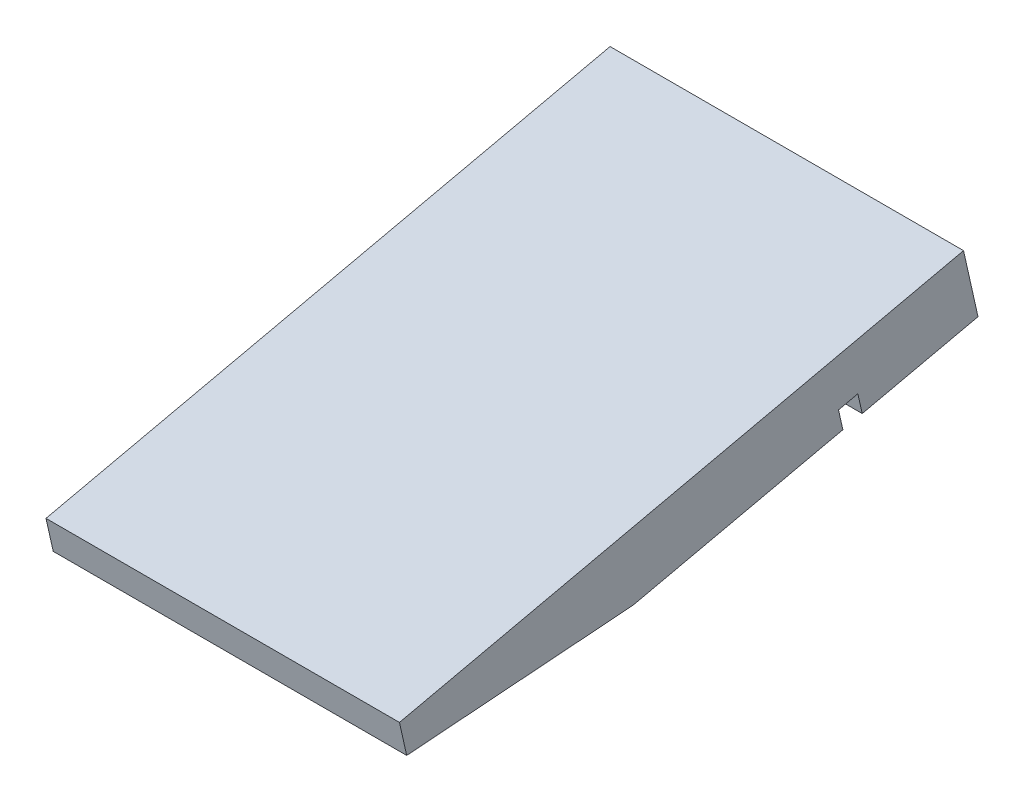
ISO-10303-21;
HEADER;
FILE_DESCRIPTION(('STEP AP214'),'2;1');
FILE_NAME('part.step','',(''),(''),'','','');
FILE_SCHEMA(('AUTOMOTIVE_DESIGN { 1 0 10303 214 1 1 1 1 }'));
ENDSEC;
DATA;
#1=APPLICATION_CONTEXT('core data for automotive mechanical design processes');
#2=APPLICATION_PROTOCOL_DEFINITION('international standard','automotive_design',2000,#1);
#3=PRODUCT_CONTEXT('',#1,'mechanical');
#4=PRODUCT('Part','Part','',(#3));
#5=PRODUCT_RELATED_PRODUCT_CATEGORY('part','',(#4));
#6=PRODUCT_DEFINITION_FORMATION('','',#4);
#7=PRODUCT_DEFINITION_CONTEXT('part definition',#1,'design');
#8=PRODUCT_DEFINITION('design','',#6,#7);
#9=PRODUCT_DEFINITION_SHAPE('','',#8);
#10=(LENGTH_UNIT() NAMED_UNIT(*) SI_UNIT(.MILLI.,.METRE.));
#11=(NAMED_UNIT(*) PLANE_ANGLE_UNIT() SI_UNIT($,.RADIAN.));
#12=(NAMED_UNIT(*) SI_UNIT($,.STERADIAN.) SOLID_ANGLE_UNIT());
#13=UNCERTAINTY_MEASURE_WITH_UNIT(LENGTH_MEASURE(1.E-05),#10,'distance_accuracy_value','');
#14=(GEOMETRIC_REPRESENTATION_CONTEXT(3) GLOBAL_UNCERTAINTY_ASSIGNED_CONTEXT((#13)) GLOBAL_UNIT_ASSIGNED_CONTEXT((#10,
#11,#12)) REPRESENTATION_CONTEXT('',''));
#15=CARTESIAN_POINT('',(0.,0.,0.));
#16=DIRECTION('',(0.,0.,1.));
#17=DIRECTION('',(1.,0.,0.));
#18=AXIS2_PLACEMENT_3D('',#15,#16,#17);
#19=CARTESIAN_POINT('',(0.,-78.8459157848909,-17.6873301860347));
#20=DIRECTION('',(0.,-0.975750024258535,-0.218887848359537));
#21=DIRECTION('',(0.,0.218887848359537,-0.975750024258535));
#22=AXIS2_PLACEMENT_3D('',#19,#20,#21);
#23=PLANE('',#22);
#24=DIRECTION('',(1.,0.,0.));
#25=VECTOR('',#24,1.);
#26=CARTESIAN_POINT('',(-13.2893035331194,-99.8207969993507,75.813707021896));
#27=LINE('',#26,#25);
#28=CARTESIAN_POINT('',(-14.878890829762,-99.8207969993507,75.813707021896));
#29=VERTEX_POINT('',#28);
#30=CARTESIAN_POINT('',(-13.2893035331194,-99.8207969993507,75.813707021896));
#31=VERTEX_POINT('',#30);
#32=EDGE_CURVE('E209',#29,#31,#27,.T.);
#33=ORIENTED_EDGE('',*,*,#32,.F.);
#34=DIRECTION('',(0.43064721422966,0.197550736870953,-0.880634250547852));
#35=VECTOR('',#34,1.);
#36=CARTESIAN_POINT('',(-14.878890829762,-99.8207969993507,75.813707021896));
#37=LINE('',#36,#35);
#38=CARTESIAN_POINT('',(-15.4126208709705,-100.065634907148,76.9051362458729));
#39=VERTEX_POINT('',#38);
#40=EDGE_CURVE('E220',#39,#29,#37,.T.);
#41=ORIENTED_EDGE('',*,*,#40,.F.);
#42=DIRECTION('',(1.,0.,0.));
#43=VECTOR('',#42,1.);
#44=CARTESIAN_POINT('',(-16.1950517829381,-100.065634907148,76.9051362458729));
#45=LINE('',#44,#43);
#46=CARTESIAN_POINT('',(-16.1950517829381,-100.065634907148,76.9051362458729));
#47=VERTEX_POINT('',#46);
#48=EDGE_CURVE('E345',#47,#39,#45,.T.);
#49=ORIENTED_EDGE('',*,*,#48,.F.);
#50=DIRECTION('',(0.,0.218887848359538,-0.975750024258535));
#51=VECTOR('',#50,1.);
#52=CARTESIAN_POINT('',(-16.1950517829381,-102.384232967623,87.2408955431996));
#53=LINE('',#52,#51);
#54=CARTESIAN_POINT('',(-16.1950517829381,-100.895914646428,80.6063260643827));
#55=VERTEX_POINT('',#54);
#56=EDGE_CURVE('E307',#55,#47,#53,.T.);
#57=ORIENTED_EDGE('',*,*,#56,.F.);
#58=DIRECTION('',(-1.,0.,0.));
#59=VECTOR('',#58,1.);
#60=CARTESIAN_POINT('',(-1.6963884059006E-13,-100.895914646428,80.606326064383));
#61=LINE('',#60,#59);
#62=CARTESIAN_POINT('',(-19.4913814338446,-100.895914646428,80.606326064383));
#63=VERTEX_POINT('',#62);
#64=EDGE_CURVE('E394',#55,#63,#61,.T.);
#65=ORIENTED_EDGE('',*,*,#64,.T.);
#66=DIRECTION('',(0.,0.218887848359537,-0.975750024258535));
#67=VECTOR('',#66,1.);
#68=CARTESIAN_POINT('',(-19.4913814338446,-78.8459157848909,-17.6873301860347));
#69=LINE('',#68,#67);
#70=CARTESIAN_POINT('',(-19.4913814338446,-99.4677189758173,74.2397690778306));
#71=VERTEX_POINT('',#70);
#72=EDGE_CURVE('E364',#63,#71,#69,.T.);
#73=ORIENTED_EDGE('',*,*,#72,.T.);
#74=DIRECTION('',(1.,0.,0.));
#75=VECTOR('',#74,1.);
#76=CARTESIAN_POINT('',(0.,-99.4677189758173,74.2397690778305));
#77=LINE('',#76,#75);
#78=CARTESIAN_POINT('',(-16.1091004786347,-99.4677189758173,74.2397690778305));
#79=VERTEX_POINT('',#78);
#80=EDGE_CURVE('E291',#71,#79,#77,.T.);
#81=ORIENTED_EDGE('',*,*,#80,.T.);
#82=DIRECTION('',(0.349886241751743,0.20505242806608,-0.914075007631784));
#83=VECTOR('',#82,1.);
#84=CARTESIAN_POINT('',(16.7428269894881,-80.2146970214158,-11.5856286308624));
#85=LINE('',#84,#83);
#86=CARTESIAN_POINT('',(-15.3511983259931,-99.0235469619147,72.2597557669568));
#87=VERTEX_POINT('',#86);
#88=EDGE_CURVE('E288',#79,#87,#85,.T.);
#89=ORIENTED_EDGE('',*,*,#88,.T.);
#90=DIRECTION('',(1.,0.,0.));
#91=VECTOR('',#90,1.);
#92=CARTESIAN_POINT('',(0.,-99.0235469619147,72.2597557669568));
#93=LINE('',#92,#91);
#94=CARTESIAN_POINT('',(-12.9315645416962,-99.0235469619147,72.2597557669568));
#95=VERTEX_POINT('',#94);
#96=EDGE_CURVE('E285',#87,#95,#93,.T.);
#97=ORIENTED_EDGE('',*,*,#96,.T.);
#98=DIRECTION('',(0.349886241751742,-0.205052428066079,0.914075007631785));
#99=VECTOR('',#98,1.);
#100=CARTESIAN_POINT('',(-41.5632032181716,-82.2438445056871,-2.54017123411558));
#101=LINE('',#100,#99);
#102=CARTESIAN_POINT('',(-12.1673626324496,-99.4714109769134,74.2562271415653));
#103=VERTEX_POINT('',#102);
#104=EDGE_CURVE('E282',#95,#103,#101,.T.);
#105=ORIENTED_EDGE('',*,*,#104,.T.);
#106=DIRECTION('',(1.,0.,0.));
#107=VECTOR('',#106,1.);
#108=CARTESIAN_POINT('',(0.,-99.4714109769134,74.2562271415653));
#109=LINE('',#108,#107);
#110=CARTESIAN_POINT('',(-8.79138143384463,-99.4714109769134,74.2562271415656));
#111=VERTEX_POINT('',#110);
#112=EDGE_CURVE('E280',#103,#111,#109,.T.);
#113=ORIENTED_EDGE('',*,*,#112,.T.);
#114=DIRECTION('',(0.,0.218887848359537,-0.975750024258535));
#115=VECTOR('',#114,1.);
#116=CARTESIAN_POINT('',(-8.79138143384463,-78.8459157848909,-17.6873301860347));
#117=LINE('',#116,#115);
#118=CARTESIAN_POINT('',(-8.79138143384463,-100.895914646428,80.606326064383));
#119=VERTEX_POINT('',#118);
#120=EDGE_CURVE('E372',#119,#111,#117,.T.);
#121=ORIENTED_EDGE('',*,*,#120,.F.);
#122=CARTESIAN_POINT('',(-12.0877110847512,-100.895914646428,80.6063260643827));
#123=VERTEX_POINT('',#122);
#124=EDGE_CURVE('E395',#119,#123,#61,.T.);
#125=ORIENTED_EDGE('',*,*,#124,.T.);
#126=DIRECTION('',(0.,-0.218887848359538,0.975750024258535));
#127=VECTOR('',#126,1.);
#128=CARTESIAN_POINT('',(-12.0877110847512,-102.384232967623,87.2408955431996));
#129=LINE('',#128,#127);
#130=CARTESIAN_POINT('',(-12.0877110847512,-100.065634907148,76.9051362458729));
#131=VERTEX_POINT('',#130);
#132=EDGE_CURVE('E334',#131,#123,#129,.T.);
#133=ORIENTED_EDGE('',*,*,#132,.F.);
#134=CARTESIAN_POINT('',(-12.8251904538077,-100.065634907148,76.9051362458729));
#135=VERTEX_POINT('',#134);
#136=EDGE_CURVE('E344',#135,#131,#45,.T.);
#137=ORIENTED_EDGE('',*,*,#136,.F.);
#138=DIRECTION('',(0.383242136627511,-0.202175304024945,0.901249472208223));
#139=VECTOR('',#138,1.);
#140=CARTESIAN_POINT('',(-12.8251904538077,-100.065634907148,76.9051362458729));
#141=LINE('',#140,#139);
#142=EDGE_CURVE('E230',#31,#135,#141,.T.);
#143=ORIENTED_EDGE('',*,*,#142,.F.);
#144=EDGE_LOOP('',(#33,#41,#49,#57,#65,#73,#81,#89,#97,#105,#113,#121,#125,#133,#137,#143));
#145=FACE_BOUND('',#144,.T.);
#146=ADVANCED_FACE('F37',(#145),#23,.T.);
#147=CARTESIAN_POINT('',(-21.7913814338446,-94.3396988072615,-7.05564161891661));
#148=DIRECTION('',(0.,-0.997214925652377,-0.0745814457899898));
#149=DIRECTION('',(0.,0.0745814457899898,-0.997214925652377));
#150=AXIS2_PLACEMENT_3D('',#147,#148,#149);
#151=PLANE('',#150);
#152=DIRECTION('',(0.,0.0745814457899898,-0.997214925652377));
#153=VECTOR('',#152,1.);
#154=CARTESIAN_POINT('',(-16.1950517829381,-94.3396988072615,-7.05564161891661));
#155=LINE('',#154,#153);
#156=CARTESIAN_POINT('',(-16.1950517829381,-101.408482943365,87.4597833915591));
#157=VERTEX_POINT('',#156);
#158=EDGE_CURVE('E11',#157,#55,#155,.T.);
#159=ORIENTED_EDGE('',*,*,#158,.F.);
#160=DIRECTION('',(1.,0.,0.));
#161=VECTOR('',#160,1.);
#162=CARTESIAN_POINT('',(-21.7913814338446,-101.408482943364,87.4597833915591));
#163=LINE('',#162,#161);
#164=CARTESIAN_POINT('',(-19.4913814338446,-101.408482943364,87.4597833915591));
#165=VERTEX_POINT('',#164);
#166=EDGE_CURVE('E357',#165,#157,#163,.T.);
#167=ORIENTED_EDGE('',*,*,#166,.F.);
#168=DIRECTION('',(0.,0.0745814457899898,-0.997214925652377));
#169=VECTOR('',#168,1.);
#170=CARTESIAN_POINT('',(-19.4913814338446,-93.4627979669583,-18.7805230154213));
#171=LINE('',#170,#169);
#172=EDGE_CURVE('E360',#165,#63,#171,.T.);
#173=ORIENTED_EDGE('',*,*,#172,.T.);
#174=ORIENTED_EDGE('',*,*,#64,.F.);
#175=EDGE_LOOP('',(#159,#167,#173,#174));
#176=FACE_BOUND('',#175,.T.);
#177=ADVANCED_FACE('F416',(#176),#151,.T.);
#178=CARTESIAN_POINT('',(0.,-102.384232967623,87.2408955431996));
#179=DIRECTION('',(0.,-0.218887848359537,0.975750024258535));
#180=DIRECTION('',(0.,-0.975750024258535,-0.218887848359537));
#181=AXIS2_PLACEMENT_3D('',#178,#179,#180);
#182=PLANE('',#181);
#183=DIRECTION('',(0.,0.975750024258535,0.218887848359537));
#184=VECTOR('',#183,1.);
#185=CARTESIAN_POINT('',(-19.4913814338446,-102.384232967623,87.2408955431995));
#186=LINE('',#185,#184);
#187=CARTESIAN_POINT('',(-19.4913814338446,-100.432732919106,87.6786712399186));
#188=VERTEX_POINT('',#187);
#189=EDGE_CURVE('E392',#165,#188,#186,.T.);
#190=ORIENTED_EDGE('',*,*,#189,.F.);
#191=ORIENTED_EDGE('',*,*,#166,.T.);
#192=DIRECTION('',(-1.,0.,0.));
#193=VECTOR('',#192,1.);
#194=CARTESIAN_POINT('',(-16.1950517829381,-101.408482943365,87.4597833915591));
#195=LINE('',#194,#193);
#196=CARTESIAN_POINT('',(-12.0877110847512,-101.408482943364,87.4597833915591));
#197=VERTEX_POINT('',#196);
#198=EDGE_CURVE('E339',#197,#157,#195,.T.);
#199=ORIENTED_EDGE('',*,*,#198,.F.);
#200=CARTESIAN_POINT('',(-8.79138143384463,-101.408482943364,87.4597833915591));
#201=VERTEX_POINT('',#200);
#202=EDGE_CURVE('E356',#197,#201,#163,.T.);
#203=ORIENTED_EDGE('',*,*,#202,.T.);
#204=DIRECTION('',(0.,0.975750024258535,0.218887848359537));
#205=VECTOR('',#204,1.);
#206=CARTESIAN_POINT('',(-8.79138143384463,-102.384232967623,87.2408955431995));
#207=LINE('',#206,#205);
#208=CARTESIAN_POINT('',(-8.79138143384463,-100.432732919106,87.6786712399186));
#209=VERTEX_POINT('',#208);
#210=EDGE_CURVE('E375',#201,#209,#207,.T.);
#211=ORIENTED_EDGE('',*,*,#210,.T.);
#212=DIRECTION('',(1.,0.,0.));
#213=VECTOR('',#212,1.);
#214=CARTESIAN_POINT('',(0.,-100.432732919106,87.6786712399186));
#215=LINE('',#214,#213);
#216=EDGE_CURVE('E363',#188,#209,#215,.T.);
#217=ORIENTED_EDGE('',*,*,#216,.F.);
#218=EDGE_LOOP('',(#190,#191,#199,#203,#211,#217));
#219=FACE_BOUND('',#218,.T.);
#220=ADVANCED_FACE('F39',(#219),#182,.T.);
#221=CARTESIAN_POINT('',(-19.4913814338446,-78.8459157848909,-17.6873301860347));
#222=DIRECTION('',(1.,0.,0.));
#223=DIRECTION('',(0.,1.,0.));
#224=AXIS2_PLACEMENT_3D('',#221,#222,#223);
#225=PLANE('',#224);
#226=CARTESIAN_POINT('',(-19.4913814338446,-99.3363862668016,73.6543190632754));
#227=VERTEX_POINT('',#226);
#228=CARTESIAN_POINT('',(-19.4913814338446,-98.5536956213311,70.1652701186752));
#229=VERTEX_POINT('',#228);
#230=EDGE_CURVE('E368',#227,#229,#69,.T.);
#231=ORIENTED_EDGE('',*,*,#230,.F.);
#232=DIRECTION('',(0.,-0.975750024258535,-0.218887848359537));
#233=VECTOR('',#232,1.);
#234=CARTESIAN_POINT('',(-19.4913814338446,-98.7509362522465,73.7856517722911));
#235=LINE('',#234,#233);
#236=CARTESIAN_POINT('',(-19.4913814338446,-98.7509362522465,73.7856517722911));
#237=VERTEX_POINT('',#236);
#238=EDGE_CURVE('E314',#237,#227,#235,.T.);
#239=ORIENTED_EDGE('',*,*,#238,.F.);
#240=DIRECTION('',(0.,0.218887848359537,-0.975750024258536));
#241=VECTOR('',#240,1.);
#242=CARTESIAN_POINT('',(-19.4913814338446,-78.2604657703359,-17.5559974770189));
#243=LINE('',#242,#241);
#244=CARTESIAN_POINT('',(-19.4913814338446,-98.8822689612622,74.3711017868463));
#245=VERTEX_POINT('',#244);
#246=EDGE_CURVE('E263',#245,#237,#243,.T.);
#247=ORIENTED_EDGE('',*,*,#246,.F.);
#248=DIRECTION('',(0.,-0.975750024258535,-0.218887848359537));
#249=VECTOR('',#248,1.);
#250=CARTESIAN_POINT('',(-19.4913814338446,-98.8822689612622,74.3711017868463));
#251=LINE('',#250,#249);
#252=EDGE_CURVE('E316',#245,#71,#251,.T.);
#253=ORIENTED_EDGE('',*,*,#252,.T.);
#254=ORIENTED_EDGE('',*,*,#72,.F.);
#255=ORIENTED_EDGE('',*,*,#172,.F.);
#256=ORIENTED_EDGE('',*,*,#189,.T.);
#257=DIRECTION('',(0.,0.218887848359537,-0.975750024258535));
#258=VECTOR('',#257,1.);
#259=CARTESIAN_POINT('',(-19.4913814338446,-76.8944157363739,-17.2495544893156));
#260=LINE('',#259,#258);
#261=CARTESIAN_POINT('',(-19.4913814338446,-96.6021955728141,70.6030458153943));
#262=VERTEX_POINT('',#261);
#263=EDGE_CURVE('E378',#188,#262,#260,.T.);
#264=ORIENTED_EDGE('',*,*,#263,.T.);
#265=DIRECTION('',(0.,0.975750024258535,0.218887848359537));
#266=VECTOR('',#265,1.);
#267=CARTESIAN_POINT('',(-19.4913814338446,-98.5536956213311,70.1652701186752));
#268=LINE('',#267,#266);
#269=EDGE_CURVE('E389',#229,#262,#268,.T.);
#270=ORIENTED_EDGE('',*,*,#269,.F.);
#271=EDGE_LOOP('',(#231,#239,#247,#253,#254,#255,#256,#264,#270));
#272=FACE_BOUND('',#271,.T.);
#273=ADVANCED_FACE('F437',(#272),#225,.F.);
#274=CARTESIAN_POINT('',(-8.79138143384463,-78.8459157848909,-17.6873301860347));
#275=DIRECTION('',(1.,0.,0.));
#276=DIRECTION('',(0.,1.,0.));
#277=AXIS2_PLACEMENT_3D('',#274,#275,#276);
#278=PLANE('',#277);
#279=DIRECTION('',(0.,-0.975750024258535,-0.218887848359537));
#280=VECTOR('',#279,1.);
#281=CARTESIAN_POINT('',(-8.79138143384463,-98.7546282533425,73.8021098360259));
#282=LINE('',#281,#280);
#283=CARTESIAN_POINT('',(-8.79138143384463,-98.7546282533425,73.8021098360259));
#284=VERTEX_POINT('',#283);
#285=CARTESIAN_POINT('',(-8.79138143384463,-99.3400782678977,73.6707771270102));
#286=VERTEX_POINT('',#285);
#287=EDGE_CURVE('E278',#284,#286,#282,.T.);
#288=ORIENTED_EDGE('',*,*,#287,.T.);
#289=CARTESIAN_POINT('',(-8.79138143384463,-98.5536956213311,70.1652701186752));
#290=VERTEX_POINT('',#289);
#291=EDGE_CURVE('E371',#286,#290,#117,.T.);
#292=ORIENTED_EDGE('',*,*,#291,.T.);
#293=DIRECTION('',(0.,0.975750024258535,0.218887848359537));
#294=VECTOR('',#293,1.);
#295=CARTESIAN_POINT('',(-8.79138143384463,-98.5536956213311,70.1652701186752));
#296=LINE('',#295,#294);
#297=CARTESIAN_POINT('',(-8.79138143384463,-96.6021955728141,70.6030458153943));
#298=VERTEX_POINT('',#297);
#299=EDGE_CURVE('E387',#290,#298,#296,.T.);
#300=ORIENTED_EDGE('',*,*,#299,.T.);
#301=DIRECTION('',(0.,0.218887848359537,-0.975750024258535));
#302=VECTOR('',#301,1.);
#303=CARTESIAN_POINT('',(-8.79138143384463,-76.8944157363739,-17.2495544893156));
#304=LINE('',#303,#302);
#305=EDGE_CURVE('E383',#209,#298,#304,.T.);
#306=ORIENTED_EDGE('',*,*,#305,.F.);
#307=ORIENTED_EDGE('',*,*,#210,.F.);
#308=DIRECTION('',(0.,0.0745814457899898,-0.997214925652377));
#309=VECTOR('',#308,1.);
#310=CARTESIAN_POINT('',(-8.79138143384463,-94.3396988072615,-7.05564161891661));
#311=LINE('',#310,#309);
#312=EDGE_CURVE('E351',#201,#119,#311,.T.);
#313=ORIENTED_EDGE('',*,*,#312,.T.);
#314=ORIENTED_EDGE('',*,*,#120,.T.);
#315=DIRECTION('',(0.,-0.975750024258535,-0.218887848359537));
#316=VECTOR('',#315,1.);
#317=CARTESIAN_POINT('',(-8.79138143384463,-98.8859609623583,74.3875598505811));
#318=LINE('',#317,#316);
#319=CARTESIAN_POINT('',(-8.79138143384463,-98.8859609623583,74.3875598505811));
#320=VERTEX_POINT('',#319);
#321=EDGE_CURVE('E60',#320,#111,#318,.T.);
#322=ORIENTED_EDGE('',*,*,#321,.F.);
#323=DIRECTION('',(0.,-0.218887848359537,0.975750024258536));
#324=VECTOR('',#323,1.);
#325=CARTESIAN_POINT('',(-8.79138143384463,-78.2604657703359,-17.5559974770189));
#326=LINE('',#325,#324);
#327=EDGE_CURVE('E249',#284,#320,#326,.T.);
#328=ORIENTED_EDGE('',*,*,#327,.F.);
#329=EDGE_LOOP('',(#288,#292,#300,#306,#307,#313,#314,#322,#328));
#330=FACE_BOUND('',#329,.T.);
#331=ADVANCED_FACE('F427',(#330),#278,.T.);
#332=DIRECTION('',(1.,0.,0.));
#333=VECTOR('',#332,1.);
#334=CARTESIAN_POINT('',(0.,-99.3400782678977,73.6707771270102));
#335=LINE('',#334,#333);
#336=CARTESIAN_POINT('',(-11.7509754584747,-99.3400782678977,73.6707771270102));
#337=VERTEX_POINT('',#336);
#338=EDGE_CURVE('E215',#337,#286,#335,.T.);
#339=ORIENTED_EDGE('',*,*,#338,.F.);
#340=DIRECTION('',(0.34988624175174,-0.20505242806608,0.914075007631785));
#341=VECTOR('',#340,1.);
#342=CARTESIAN_POINT('',(-41.0011279007808,-82.1978929977104,-2.74501213944192));
#343=LINE('',#342,#341);
#344=CARTESIAN_POINT('',(-12.5151773677212,-98.892214252899,71.6743057524016));
#345=VERTEX_POINT('',#344);
#346=EDGE_CURVE('E250',#345,#337,#343,.T.);
#347=ORIENTED_EDGE('',*,*,#346,.F.);
#348=DIRECTION('',(1.,0.,0.));
#349=VECTOR('',#348,1.);
#350=CARTESIAN_POINT('',(0.,-98.892214252899,71.6743057524016));
#351=LINE('',#350,#349);
#352=CARTESIAN_POINT('',(-15.767585499968,-98.892214252899,71.6743057524016));
#353=VERTEX_POINT('',#352);
#354=EDGE_CURVE('E300',#353,#345,#351,.T.);
#355=ORIENTED_EDGE('',*,*,#354,.F.);
#356=DIRECTION('',(0.34988624175174,0.20505242806608,-0.914075007631785));
#357=VECTOR('',#356,1.);
#358=CARTESIAN_POINT('',(16.1807516720972,-80.1687455134392,-11.7904695361888));
#359=LINE('',#358,#357);
#360=CARTESIAN_POINT('',(-16.5254876526097,-99.3363862668016,73.6543190632754));
#361=VERTEX_POINT('',#360);
#362=EDGE_CURVE('E297',#361,#353,#359,.T.);
#363=ORIENTED_EDGE('',*,*,#362,.F.);
#364=DIRECTION('',(1.,0.,0.));
#365=VECTOR('',#364,1.);
#366=CARTESIAN_POINT('',(0.,-99.3363862668016,73.6543190632754));
#367=LINE('',#366,#365);
#368=EDGE_CURVE('E294',#227,#361,#367,.T.);
#369=ORIENTED_EDGE('',*,*,#368,.F.);
#370=ORIENTED_EDGE('',*,*,#230,.T.);
#371=DIRECTION('',(1.,0.,0.));
#372=VECTOR('',#371,1.);
#373=CARTESIAN_POINT('',(0.,-98.5536956213311,70.1652701186752));
#374=LINE('',#373,#372);
#375=EDGE_CURVE('E367',#229,#290,#374,.T.);
#376=ORIENTED_EDGE('',*,*,#375,.T.);
#377=ORIENTED_EDGE('',*,*,#291,.F.);
#378=EDGE_LOOP('',(#339,#347,#355,#363,#369,#370,#376,#377));
#379=FACE_BOUND('',#378,.T.);
#380=ADVANCED_FACE('F445',(#379),#23,.T.);
#381=CARTESIAN_POINT('',(0.,-98.5536956213311,70.1652701186752));
#382=DIRECTION('',(0.,-0.218887848359537,0.975750024258535));
#383=DIRECTION('',(0.,-0.975750024258535,-0.218887848359537));
#384=AXIS2_PLACEMENT_3D('',#381,#382,#383);
#385=PLANE('',#384);
#386=DIRECTION('',(1.,0.,0.));
#387=VECTOR('',#386,1.);
#388=CARTESIAN_POINT('',(0.,-96.6021955728141,70.6030458153943));
#389=LINE('',#388,#387);
#390=EDGE_CURVE('E380',#262,#298,#389,.T.);
#391=ORIENTED_EDGE('',*,*,#390,.T.);
#392=ORIENTED_EDGE('',*,*,#299,.F.);
#393=ORIENTED_EDGE('',*,*,#375,.F.);
#394=ORIENTED_EDGE('',*,*,#269,.T.);
#395=EDGE_LOOP('',(#391,#392,#393,#394));
#396=FACE_BOUND('',#395,.T.);
#397=ADVANCED_FACE('F440',(#396),#385,.F.);
#398=CARTESIAN_POINT('',(0.,-76.8944157363739,-17.2495544893156));
#399=DIRECTION('',(0.,-0.975750024258535,-0.218887848359537));
#400=DIRECTION('',(0.,0.218887848359537,-0.975750024258535));
#401=AXIS2_PLACEMENT_3D('',#398,#399,#400);
#402=PLANE('',#401);
#403=ORIENTED_EDGE('',*,*,#216,.T.);
#404=ORIENTED_EDGE('',*,*,#305,.T.);
#405=ORIENTED_EDGE('',*,*,#390,.F.);
#406=ORIENTED_EDGE('',*,*,#263,.F.);
#407=EDGE_LOOP('',(#403,#404,#405,#406));
#408=FACE_BOUND('',#407,.T.);
#409=ADVANCED_FACE('F432',(#408),#402,.F.);
#410=DIRECTION('',(0.,-0.0745814457899898,0.997214925652377));
#411=VECTOR('',#410,1.);
#412=CARTESIAN_POINT('',(-12.0877110847512,-94.3396988072615,-7.05564161891661));
#413=LINE('',#412,#411);
#414=EDGE_CURVE('E45',#123,#197,#413,.T.);
#415=ORIENTED_EDGE('',*,*,#414,.F.);
#416=ORIENTED_EDGE('',*,*,#124,.F.);
#417=ORIENTED_EDGE('',*,*,#312,.F.);
#418=ORIENTED_EDGE('',*,*,#202,.F.);
#419=EDGE_LOOP('',(#415,#416,#417,#418));
#420=FACE_BOUND('',#419,.T.);
#421=ADVANCED_FACE('F407',(#420),#151,.T.);
#422=CARTESIAN_POINT('',(-16.1950517829381,-101.408482943365,87.4597833915591));
#423=DIRECTION('',(-1.,0.,0.));
#424=DIRECTION('',(0.,-1.,0.));
#425=AXIS2_PLACEMENT_3D('',#422,#423,#424);
#426=PLANE('',#425);
#427=ORIENTED_EDGE('',*,*,#158,.T.);
#428=ORIENTED_EDGE('',*,*,#56,.T.);
#429=DIRECTION('',(0.,-0.975750024258535,-0.218887848359537));
#430=VECTOR('',#429,1.);
#431=CARTESIAN_POINT('',(-16.1950517829381,-99.0898848828899,77.1240240942324));
#432=LINE('',#431,#430);
#433=CARTESIAN_POINT('',(-16.1950517829381,-99.0898848828899,77.1240240942324));
#434=VERTEX_POINT('',#433);
#435=EDGE_CURVE('E342',#434,#47,#432,.T.);
#436=ORIENTED_EDGE('',*,*,#435,.F.);
#437=DIRECTION('',(0.,0.218887848359538,-0.975750024258535));
#438=VECTOR('',#437,1.);
#439=CARTESIAN_POINT('',(-16.1950517829381,-101.408482943365,87.4597833915591));
#440=LINE('',#439,#438);
#441=EDGE_CURVE('E330',#157,#434,#440,.T.);
#442=ORIENTED_EDGE('',*,*,#441,.F.);
#443=EDGE_LOOP('',(#427,#428,#436,#442));
#444=FACE_BOUND('',#443,.T.);
#445=ADVANCED_FACE('F420',(#444),#426,.F.);
#446=CARTESIAN_POINT('',(-12.0877110847512,-101.408482943365,87.4597833915591));
#447=DIRECTION('',(1.,0.,0.));
#448=DIRECTION('',(0.,1.,0.));
#449=AXIS2_PLACEMENT_3D('',#446,#447,#448);
#450=PLANE('',#449);
#451=ORIENTED_EDGE('',*,*,#414,.T.);
#452=DIRECTION('',(0.,-0.218887848359538,0.975750024258535));
#453=VECTOR('',#452,1.);
#454=CARTESIAN_POINT('',(-12.0877110847512,-101.408482943365,87.4597833915591));
#455=LINE('',#454,#453);
#456=CARTESIAN_POINT('',(-12.0877110847512,-99.0898848828899,77.1240240942324));
#457=VERTEX_POINT('',#456);
#458=EDGE_CURVE('E337',#457,#197,#455,.T.);
#459=ORIENTED_EDGE('',*,*,#458,.F.);
#460=DIRECTION('',(0.,-0.975750024258535,-0.218887848359537));
#461=VECTOR('',#460,1.);
#462=CARTESIAN_POINT('',(-12.0877110847512,-99.0898848828899,77.1240240942324));
#463=LINE('',#462,#461);
#464=EDGE_CURVE('E348',#457,#131,#463,.T.);
#465=ORIENTED_EDGE('',*,*,#464,.T.);
#466=ORIENTED_EDGE('',*,*,#132,.T.);
#467=EDGE_LOOP('',(#451,#459,#465,#466));
#468=FACE_BOUND('',#467,.T.);
#469=ADVANCED_FACE('F402',(#468),#450,.F.);
#470=CARTESIAN_POINT('',(-16.1950517829381,-99.0898848828899,77.1240240942324));
#471=DIRECTION('',(0.,0.218887848359537,-0.975750024258535));
#472=DIRECTION('',(0.,0.975750024258535,0.218887848359538));
#473=AXIS2_PLACEMENT_3D('',#470,#471,#472);
#474=PLANE('',#473);
#475=ORIENTED_EDGE('',*,*,#48,.T.);
#476=DIRECTION('',(-1.,0.,0.));
#477=VECTOR('',#476,1.);
#478=CARTESIAN_POINT('',(-15.4126208709705,-100.065634907148,76.9051362458729));
#479=LINE('',#478,#477);
#480=EDGE_CURVE('E232',#135,#39,#479,.T.);
#481=ORIENTED_EDGE('',*,*,#480,.F.);
#482=ORIENTED_EDGE('',*,*,#136,.T.);
#483=ORIENTED_EDGE('',*,*,#464,.F.);
#484=DIRECTION('',(1.,0.,0.));
#485=VECTOR('',#484,1.);
#486=CARTESIAN_POINT('',(-16.1950517829381,-99.0898848828899,77.1240240942324));
#487=LINE('',#486,#485);
#488=EDGE_CURVE('E333',#434,#457,#487,.T.);
#489=ORIENTED_EDGE('',*,*,#488,.F.);
#490=ORIENTED_EDGE('',*,*,#435,.T.);
#491=EDGE_LOOP('',(#475,#481,#482,#483,#489,#490));
#492=FACE_BOUND('',#491,.T.);
#493=ADVANCED_FACE('F423',(#492),#474,.F.);
#494=CARTESIAN_POINT('',(0.,-77.8701657606324,-17.4684423376752));
#495=DIRECTION('',(0.,-0.975750024258535,-0.218887848359538));
#496=DIRECTION('',(0.,0.218887848359538,-0.975750024258535));
#497=AXIS2_PLACEMENT_3D('',#494,#495,#496);
#498=PLANE('',#497);
#499=ORIENTED_EDGE('',*,*,#441,.T.);
#500=ORIENTED_EDGE('',*,*,#488,.T.);
#501=ORIENTED_EDGE('',*,*,#458,.T.);
#502=ORIENTED_EDGE('',*,*,#198,.T.);
#503=EDGE_LOOP('',(#499,#500,#501,#502));
#504=FACE_BOUND('',#503,.T.);
#505=ADVANCED_FACE('F413',(#504),#498,.T.);
#506=CARTESIAN_POINT('',(0.,-98.7546282533425,73.8021098360259));
#507=DIRECTION('',(0.,0.218887848359537,-0.975750024258535));
#508=DIRECTION('',(0.,0.975750024258535,0.218887848359538));
#509=AXIS2_PLACEMENT_3D('',#506,#507,#508);
#510=PLANE('',#509);
#511=ORIENTED_EDGE('',*,*,#338,.T.);
#512=ORIENTED_EDGE('',*,*,#287,.F.);
#513=DIRECTION('',(1.,0.,0.));
#514=VECTOR('',#513,1.);
#515=CARTESIAN_POINT('',(0.,-98.7546282533425,73.8021098360259));
#516=LINE('',#515,#514);
#517=CARTESIAN_POINT('',(-11.7509754584747,-98.7546282533425,73.8021098360259));
#518=VERTEX_POINT('',#517);
#519=EDGE_CURVE('E246',#518,#284,#516,.T.);
#520=ORIENTED_EDGE('',*,*,#519,.F.);
#521=DIRECTION('',(0.,-0.975750024258535,-0.218887848359537));
#522=VECTOR('',#521,1.);
#523=CARTESIAN_POINT('',(-11.7509754584747,-98.7546282533425,73.8021098360259));
#524=LINE('',#523,#522);
#525=EDGE_CURVE('E305',#518,#337,#524,.T.);
#526=ORIENTED_EDGE('',*,*,#525,.T.);
#527=EDGE_LOOP('',(#511,#512,#520,#526));
#528=FACE_BOUND('',#527,.T.);
#529=ADVANCED_FACE('F517',(#528),#510,.F.);
#530=CARTESIAN_POINT('',(-41.0011279007808,-81.6124429831553,-2.6136794304262));
#531=DIRECTION('',(0.936792195651118,0.0765858466276435,-0.341401508876988));
#532=DIRECTION('',(-0.342407161780015,0.,-0.939551667318916));
#533=AXIS2_PLACEMENT_3D('',#530,#531,#532);
#534=PLANE('',#533);
#535=ORIENTED_EDGE('',*,*,#346,.T.);
#536=ORIENTED_EDGE('',*,*,#525,.F.);
#537=DIRECTION('',(0.34988624175174,-0.20505242806608,0.914075007631785));
#538=VECTOR('',#537,1.);
#539=CARTESIAN_POINT('',(-41.0011279007808,-81.6124429831553,-2.6136794304262));
#540=LINE('',#539,#538);
#541=CARTESIAN_POINT('',(-12.5151773677212,-98.3067642383439,71.8056384614174));
#542=VERTEX_POINT('',#541);
#543=EDGE_CURVE('E275',#542,#518,#540,.T.);
#544=ORIENTED_EDGE('',*,*,#543,.F.);
#545=DIRECTION('',(0.,-0.975750024258535,-0.218887848359537));
#546=VECTOR('',#545,1.);
#547=CARTESIAN_POINT('',(-12.5151773677212,-98.3067642383439,71.8056384614174));
#548=LINE('',#547,#546);
#549=EDGE_CURVE('E308',#542,#345,#548,.T.);
#550=ORIENTED_EDGE('',*,*,#549,.T.);
#551=EDGE_LOOP('',(#535,#536,#544,#550));
#552=FACE_BOUND('',#551,.T.);
#553=ADVANCED_FACE('F519',(#552),#534,.F.);
#554=CARTESIAN_POINT('',(0.,-98.3067642383439,71.8056384614174));
#555=DIRECTION('',(0.,0.218887848359537,-0.975750024258535));
#556=DIRECTION('',(0.,0.975750024258535,0.218887848359538));
#557=AXIS2_PLACEMENT_3D('',#554,#555,#556);
#558=PLANE('',#557);
#559=ORIENTED_EDGE('',*,*,#354,.T.);
#560=ORIENTED_EDGE('',*,*,#549,.F.);
#561=DIRECTION('',(1.,0.,0.));
#562=VECTOR('',#561,1.);
#563=CARTESIAN_POINT('',(0.,-98.3067642383439,71.8056384614174));
#564=LINE('',#563,#562);
#565=CARTESIAN_POINT('',(-15.767585499968,-98.3067642383439,71.8056384614173));
#566=VERTEX_POINT('',#565);
#567=EDGE_CURVE('E272',#566,#542,#564,.T.);
#568=ORIENTED_EDGE('',*,*,#567,.F.);
#569=DIRECTION('',(0.,-0.975750024258535,-0.218887848359537));
#570=VECTOR('',#569,1.);
#571=CARTESIAN_POINT('',(-15.767585499968,-98.3067642383439,71.8056384614173));
#572=LINE('',#571,#570);
#573=EDGE_CURVE('E310',#566,#353,#572,.T.);
#574=ORIENTED_EDGE('',*,*,#573,.T.);
#575=EDGE_LOOP('',(#559,#560,#568,#574));
#576=FACE_BOUND('',#575,.T.);
#577=ADVANCED_FACE('F524',(#576),#558,.F.);
#578=CARTESIAN_POINT('',(16.1807516720972,-79.5832954988841,-11.659136827173));
#579=DIRECTION('',(-0.936792195651118,0.0765858466276431,-0.341401508876988));
#580=DIRECTION('',(-0.342407161780015,0.,0.939551667318916));
#581=AXIS2_PLACEMENT_3D('',#578,#579,#580);
#582=PLANE('',#581);
#583=ORIENTED_EDGE('',*,*,#362,.T.);
#584=ORIENTED_EDGE('',*,*,#573,.F.);
#585=DIRECTION('',(0.34988624175174,0.20505242806608,-0.914075007631785));
#586=VECTOR('',#585,1.);
#587=CARTESIAN_POINT('',(16.1807516720972,-79.5832954988841,-11.659136827173));
#588=LINE('',#587,#586);
#589=CARTESIAN_POINT('',(-16.5254876526097,-98.7509362522464,73.7856517722911));
#590=VERTEX_POINT('',#589);
#591=EDGE_CURVE('E269',#590,#566,#588,.T.);
#592=ORIENTED_EDGE('',*,*,#591,.F.);
#593=DIRECTION('',(0.,-0.975750024258535,-0.218887848359537));
#594=VECTOR('',#593,1.);
#595=CARTESIAN_POINT('',(-16.5254876526097,-98.7509362522464,73.7856517722911));
#596=LINE('',#595,#594);
#597=EDGE_CURVE('E312',#590,#361,#596,.T.);
#598=ORIENTED_EDGE('',*,*,#597,.T.);
#599=EDGE_LOOP('',(#583,#584,#592,#598));
#600=FACE_BOUND('',#599,.T.);
#601=ADVANCED_FACE('F535',(#600),#582,.F.);
#602=CARTESIAN_POINT('',(0.,-98.7509362522464,73.7856517722911));
#603=DIRECTION('',(0.,0.218887848359537,-0.975750024258535));
#604=DIRECTION('',(0.,0.975750024258535,0.218887848359538));
#605=AXIS2_PLACEMENT_3D('',#602,#603,#604);
#606=PLANE('',#605);
#607=ORIENTED_EDGE('',*,*,#368,.T.);
#608=ORIENTED_EDGE('',*,*,#597,.F.);
#609=DIRECTION('',(1.,0.,0.));
#610=VECTOR('',#609,1.);
#611=CARTESIAN_POINT('',(0.,-98.7509362522464,73.7856517722911));
#612=LINE('',#611,#610);
#613=EDGE_CURVE('E266',#237,#590,#612,.T.);
#614=ORIENTED_EDGE('',*,*,#613,.F.);
#615=ORIENTED_EDGE('',*,*,#238,.T.);
#616=EDGE_LOOP('',(#607,#608,#614,#615));
#617=FACE_BOUND('',#616,.T.);
#618=ADVANCED_FACE('F451',(#617),#606,.F.);
#619=CARTESIAN_POINT('',(0.,-98.8822689612622,74.3711017868463));
#620=DIRECTION('',(0.,0.218887848359537,-0.975750024258535));
#621=DIRECTION('',(0.,0.975750024258535,0.218887848359538));
#622=AXIS2_PLACEMENT_3D('',#619,#620,#621);
#623=PLANE('',#622);
#624=ORIENTED_EDGE('',*,*,#80,.F.);
#625=ORIENTED_EDGE('',*,*,#252,.F.);
#626=DIRECTION('',(1.,0.,0.));
#627=VECTOR('',#626,1.);
#628=CARTESIAN_POINT('',(0.,-98.8822689612622,74.3711017868463));
#629=LINE('',#628,#627);
#630=CARTESIAN_POINT('',(-16.1091004786347,-98.8822689612622,74.3711017868463));
#631=VERTEX_POINT('',#630);
#632=EDGE_CURVE('E261',#245,#631,#629,.T.);
#633=ORIENTED_EDGE('',*,*,#632,.T.);
#634=DIRECTION('',(0.,-0.975750024258535,-0.218887848359537));
#635=VECTOR('',#634,1.);
#636=CARTESIAN_POINT('',(-16.1091004786347,-98.8822689612622,74.3711017868463));
#637=LINE('',#636,#635);
#638=EDGE_CURVE('E319',#631,#79,#637,.T.);
#639=ORIENTED_EDGE('',*,*,#638,.T.);
#640=EDGE_LOOP('',(#624,#625,#633,#639));
#641=FACE_BOUND('',#640,.T.);
#642=ADVANCED_FACE('F460',(#641),#623,.T.);
#643=CARTESIAN_POINT('',(16.7428269894881,-79.6292470068607,-11.4542959218467));
#644=DIRECTION('',(-0.936792195651117,0.0765858466276437,-0.341401508876991));
#645=DIRECTION('',(-0.342407161780017,0.,0.939551667318915));
#646=AXIS2_PLACEMENT_3D('',#643,#644,#645);
#647=PLANE('',#646);
#648=ORIENTED_EDGE('',*,*,#88,.F.);
#649=ORIENTED_EDGE('',*,*,#638,.F.);
#650=DIRECTION('',(0.349886241751743,0.20505242806608,-0.914075007631784));
#651=VECTOR('',#650,1.);
#652=CARTESIAN_POINT('',(16.7428269894881,-79.6292470068607,-11.4542959218467));
#653=LINE('',#652,#651);
#654=CARTESIAN_POINT('',(-15.3511983259931,-98.4380969473596,72.3910884759725));
#655=VERTEX_POINT('',#654);
#656=EDGE_CURVE('E259',#631,#655,#653,.T.);
#657=ORIENTED_EDGE('',*,*,#656,.T.);
#658=DIRECTION('',(0.,-0.975750024258535,-0.218887848359537));
#659=VECTOR('',#658,1.);
#660=CARTESIAN_POINT('',(-15.3511983259931,-98.4380969473596,72.3910884759725));
#661=LINE('',#660,#659);
#662=EDGE_CURVE('E321',#655,#87,#661,.T.);
#663=ORIENTED_EDGE('',*,*,#662,.T.);
#664=EDGE_LOOP('',(#648,#649,#657,#663));
#665=FACE_BOUND('',#664,.T.);
#666=ADVANCED_FACE('F463',(#665),#647,.T.);
#667=CARTESIAN_POINT('',(0.,-98.4380969473596,72.3910884759725));
#668=DIRECTION('',(0.,0.218887848359537,-0.975750024258535));
#669=DIRECTION('',(0.,0.975750024258535,0.218887848359538));
#670=AXIS2_PLACEMENT_3D('',#667,#668,#669);
#671=PLANE('',#670);
#672=ORIENTED_EDGE('',*,*,#96,.F.);
#673=ORIENTED_EDGE('',*,*,#662,.F.);
#674=DIRECTION('',(1.,0.,0.));
#675=VECTOR('',#674,1.);
#676=CARTESIAN_POINT('',(0.,-98.4380969473596,72.3910884759725));
#677=LINE('',#676,#675);
#678=CARTESIAN_POINT('',(-12.9315645416962,-98.4380969473596,72.3910884759725));
#679=VERTEX_POINT('',#678);
#680=EDGE_CURVE('E257',#655,#679,#677,.T.);
#681=ORIENTED_EDGE('',*,*,#680,.T.);
#682=DIRECTION('',(0.,-0.975750024258535,-0.218887848359537));
#683=VECTOR('',#682,1.);
#684=CARTESIAN_POINT('',(-12.9315645416962,-98.4380969473596,72.3910884759725));
#685=LINE('',#684,#683);
#686=EDGE_CURVE('E323',#679,#95,#685,.T.);
#687=ORIENTED_EDGE('',*,*,#686,.T.);
#688=EDGE_LOOP('',(#672,#673,#681,#687));
#689=FACE_BOUND('',#688,.T.);
#690=ADVANCED_FACE('F469',(#689),#671,.T.);
#691=CARTESIAN_POINT('',(-41.5632032181716,-81.6583944911319,-2.40883852509986));
#692=DIRECTION('',(0.936792195651117,0.0765858466276439,-0.34140150887699));
#693=DIRECTION('',(-0.342407161780017,0.,-0.939551667318915));
#694=AXIS2_PLACEMENT_3D('',#691,#692,#693);
#695=PLANE('',#694);
#696=ORIENTED_EDGE('',*,*,#104,.F.);
#697=ORIENTED_EDGE('',*,*,#686,.F.);
#698=DIRECTION('',(0.349886241751742,-0.205052428066079,0.914075007631785));
#699=VECTOR('',#698,1.);
#700=CARTESIAN_POINT('',(-41.5632032181716,-81.6583944911319,-2.40883852509986));
#701=LINE('',#700,#699);
#702=CARTESIAN_POINT('',(-12.1673626324496,-98.8859609623583,74.3875598505811));
#703=VERTEX_POINT('',#702);
#704=EDGE_CURVE('E255',#679,#703,#701,.T.);
#705=ORIENTED_EDGE('',*,*,#704,.T.);
#706=DIRECTION('',(0.,-0.975750024258535,-0.218887848359537));
#707=VECTOR('',#706,1.);
#708=CARTESIAN_POINT('',(-12.1673626324496,-98.8859609623583,74.3875598505811));
#709=LINE('',#708,#707);
#710=EDGE_CURVE('E325',#703,#103,#709,.T.);
#711=ORIENTED_EDGE('',*,*,#710,.T.);
#712=EDGE_LOOP('',(#696,#697,#705,#711));
#713=FACE_BOUND('',#712,.T.);
#714=ADVANCED_FACE('F473',(#713),#695,.T.);
#715=CARTESIAN_POINT('',(0.,-98.8859609623583,74.3875598505811));
#716=DIRECTION('',(0.,0.218887848359537,-0.975750024258535));
#717=DIRECTION('',(0.,0.975750024258535,0.218887848359538));
#718=AXIS2_PLACEMENT_3D('',#715,#716,#717);
#719=PLANE('',#718);
#720=ORIENTED_EDGE('',*,*,#112,.F.);
#721=ORIENTED_EDGE('',*,*,#710,.F.);
#722=DIRECTION('',(1.,0.,0.));
#723=VECTOR('',#722,1.);
#724=CARTESIAN_POINT('',(0.,-98.8859609623583,74.3875598505811));
#725=LINE('',#724,#723);
#726=EDGE_CURVE('E253',#703,#320,#725,.T.);
#727=ORIENTED_EDGE('',*,*,#726,.T.);
#728=ORIENTED_EDGE('',*,*,#321,.T.);
#729=EDGE_LOOP('',(#720,#721,#727,#728));
#730=FACE_BOUND('',#729,.T.);
#731=ADVANCED_FACE('F476',(#730),#719,.T.);
#732=CARTESIAN_POINT('',(0.,-78.2604657703359,-17.5559974770189));
#733=DIRECTION('',(0.,-0.975750024258535,-0.218887848359537));
#734=DIRECTION('',(0.,0.218887848359537,-0.975750024258535));
#735=AXIS2_PLACEMENT_3D('',#732,#733,#734);
#736=PLANE('',#735);
#737=ORIENTED_EDGE('',*,*,#519,.T.);
#738=ORIENTED_EDGE('',*,*,#327,.T.);
#739=ORIENTED_EDGE('',*,*,#726,.F.);
#740=ORIENTED_EDGE('',*,*,#704,.F.);
#741=ORIENTED_EDGE('',*,*,#680,.F.);
#742=ORIENTED_EDGE('',*,*,#656,.F.);
#743=ORIENTED_EDGE('',*,*,#632,.F.);
#744=ORIENTED_EDGE('',*,*,#246,.T.);
#745=ORIENTED_EDGE('',*,*,#613,.T.);
#746=ORIENTED_EDGE('',*,*,#591,.T.);
#747=ORIENTED_EDGE('',*,*,#567,.T.);
#748=ORIENTED_EDGE('',*,*,#543,.T.);
#749=EDGE_LOOP('',(#737,#738,#739,#740,#741,#742,#743,#744,#745,#746,#747,#748));
#750=FACE_BOUND('',#749,.T.);
#751=ADVANCED_FACE('F455',(#750),#736,.T.);
#752=CARTESIAN_POINT('',(-14.878890829762,-99.8207969993507,75.813707021896));
#753=DIRECTION('',(-0.773610929727145,-0.421748873846587,-0.472920729949363));
#754=DIRECTION('',(-0.521577275162581,0.,0.85320404712705));
#755=AXIS2_PLACEMENT_3D('',#752,#753,#754);
#756=PLANE('',#755);
#757=ORIENTED_EDGE('',*,*,#40,.T.);
#758=DIRECTION('',(-0.309009107693938,0.902665950226181,-0.299512192847741));
#759=VECTOR('',#758,1.);
#760=CARTESIAN_POINT('',(-14.7271064978801,-100.2641837629,75.9608264981507));
#761=LINE('',#760,#759);
#762=CARTESIAN_POINT('',(-14.6514599457403,-100.485159666744,76.0341481710356));
#763=VERTEX_POINT('',#762);
#764=EDGE_CURVE('E204',#763,#29,#761,.T.);
#765=ORIENTED_EDGE('',*,*,#764,.F.);
#766=DIRECTION('',(-0.43064721422966,-0.197550736870953,0.880634250547852));
#767=VECTOR('',#766,1.);
#768=CARTESIAN_POINT('',(25.4498930886022,-82.0894715496673,-5.96945897762243));
#769=LINE('',#768,#767);
#770=CARTESIAN_POINT('',(-14.8411415197011,-100.572172268866,76.4220296787019));
#771=VERTEX_POINT('',#770);
#772=EDGE_CURVE('E235',#771,#763,#769,.F.);
#773=ORIENTED_EDGE('',*,*,#772,.F.);
#774=DIRECTION('',(-0.632421033007459,0.560553729268817,0.534624310719781));
#775=VECTOR('',#774,1.);
#776=CARTESIAN_POINT('',(-14.9169280647783,-100.504997984245,76.4860966962567));
#777=LINE('',#776,#775);
#778=EDGE_CURVE('E223',#771,#39,#777,.T.);
#779=ORIENTED_EDGE('',*,*,#778,.T.);
#780=EDGE_LOOP('',(#757,#765,#773,#779));
#781=FACE_BOUND('',#780,.T.);
#782=ADVANCED_FACE('F221',(#781),#756,.T.);
#783=CARTESIAN_POINT('',(-13.2893035331194,-99.8207969993507,75.813707021896));
#784=DIRECTION('',(0.,-0.314924907952717,-0.949116590494009));
#785=DIRECTION('',(0.,0.949116590494009,-0.314924907952717));
#786=AXIS2_PLACEMENT_3D('',#783,#784,#785);
#787=PLANE('',#786);
#788=ORIENTED_EDGE('',*,*,#32,.T.);
#789=DIRECTION('',(0.325216936344216,0.897522078033807,-0.297805412571294));
#790=VECTOR('',#789,1.);
#791=CARTESIAN_POINT('',(-13.4173881175094,-100.174280257751,75.9309957551553));
#792=LINE('',#791,#790);
#793=CARTESIAN_POINT('',(-13.5300352060208,-100.485159666744,76.0341481710356));
#794=VERTEX_POINT('',#793);
#795=EDGE_CURVE('E216',#794,#31,#792,.T.);
#796=ORIENTED_EDGE('',*,*,#795,.F.);
#797=DIRECTION('',(-1.,0.,0.));
#798=VECTOR('',#797,1.);
#799=CARTESIAN_POINT('',(0.,-100.485159666744,76.0341481710356));
#800=LINE('',#799,#798);
#801=EDGE_CURVE('E211',#763,#794,#800,.F.);
#802=ORIENTED_EDGE('',*,*,#801,.F.);
#803=ORIENTED_EDGE('',*,*,#764,.T.);
#804=EDGE_LOOP('',(#788,#796,#802,#803));
#805=FACE_BOUND('',#804,.T.);
#806=ADVANCED_FACE('F206',(#805),#787,.T.);
#807=CARTESIAN_POINT('',(-12.8251904538077,-100.065634907148,76.9051362458729));
#808=DIRECTION('',(0.791720787236423,-0.430643180714896,-0.43327202305422));
#809=DIRECTION('',(-0.480067956928053,0.,-0.877231301727728));
#810=AXIS2_PLACEMENT_3D('',#807,#808,#809);
#811=PLANE('',#810);
#812=ORIENTED_EDGE('',*,*,#142,.T.);
#813=DIRECTION('',(0.610746471696563,0.57300142509618,0.546496216041746));
#814=VECTOR('',#813,1.);
#815=CARTESIAN_POINT('',(-13.7903311149613,-100.971128430055,76.0415279505956));
#816=LINE('',#815,#814);
#817=CARTESIAN_POINT('',(-13.3650947069244,-100.572172268866,76.4220296787019));
#818=VERTEX_POINT('',#817);
#819=EDGE_CURVE('E52',#818,#135,#816,.T.);
#820=ORIENTED_EDGE('',*,*,#819,.F.);
#821=DIRECTION('',(-0.383242136627511,0.202175304024945,-0.901249472208224));
#822=VECTOR('',#821,1.);
#823=CARTESIAN_POINT('',(-45.5905677528489,-83.5719674695176,0.639155619297251));
#824=LINE('',#823,#822);
#825=EDGE_CURVE('E243',#794,#818,#824,.F.);
#826=ORIENTED_EDGE('',*,*,#825,.F.);
#827=ORIENTED_EDGE('',*,*,#795,.T.);
#828=EDGE_LOOP('',(#812,#820,#826,#827));
#829=FACE_BOUND('',#828,.T.);
#830=ADVANCED_FACE('F599',(#829),#811,.T.);
#831=CARTESIAN_POINT('',(-15.4126208709705,-100.065634907148,76.9051362458729));
#832=DIRECTION('',(0.,-0.690171920222393,0.723645438413409));
#833=DIRECTION('',(0.,-0.723645438413409,-0.690171920222393));
#834=AXIS2_PLACEMENT_3D('',#831,#832,#833);
#835=PLANE('',#834);
#836=ORIENTED_EDGE('',*,*,#480,.T.);
#837=ORIENTED_EDGE('',*,*,#778,.F.);
#838=DIRECTION('',(1.,0.,0.));
#839=VECTOR('',#838,1.);
#840=CARTESIAN_POINT('',(0.,-100.572172268866,76.4220296787019));
#841=LINE('',#840,#839);
#842=EDGE_CURVE('E238',#818,#771,#841,.F.);
#843=ORIENTED_EDGE('',*,*,#842,.F.);
#844=ORIENTED_EDGE('',*,*,#819,.T.);
#845=EDGE_LOOP('',(#836,#837,#843,#844));
#846=FACE_BOUND('',#845,.T.);
#847=ADVANCED_FACE('F608',(#846),#835,.T.);
#848=CARTESIAN_POINT('',(0.,-79.4313657994473,-17.8186628950498));
#849=DIRECTION('',(0.,0.975750024258538,0.218887848359527));
#850=DIRECTION('',(0.,-0.218887848359527,0.975750024258538));
#851=AXIS2_PLACEMENT_3D('',#848,#849,#850);
#852=PLANE('',#851);
#853=ORIENTED_EDGE('',*,*,#772,.T.);
#854=ORIENTED_EDGE('',*,*,#801,.T.);
#855=ORIENTED_EDGE('',*,*,#825,.T.);
#856=ORIENTED_EDGE('',*,*,#842,.T.);
#857=EDGE_LOOP('',(#853,#854,#855,#856));
#858=FACE_BOUND('',#857,.T.);
#859=ADVANCED_FACE('F618',(#858),#852,.F.);
#860=CLOSED_SHELL('',(#146,#177,#220,#273,#331,#380,#397,#409,#421,#445,#469,#493,#505,#529,
#553,#577,#601,#618,#642,#666,#690,#714,#731,#751,#782,#806,#830,#847,#859));
#861=MANIFOLD_SOLID_BREP('B2',#860);
#862=ADVANCED_BREP_SHAPE_REPRESENTATION('',(#18,#861),#14);
#863=SHAPE_DEFINITION_REPRESENTATION(#9,#862);
ENDSEC;
END-ISO-10303-21;
